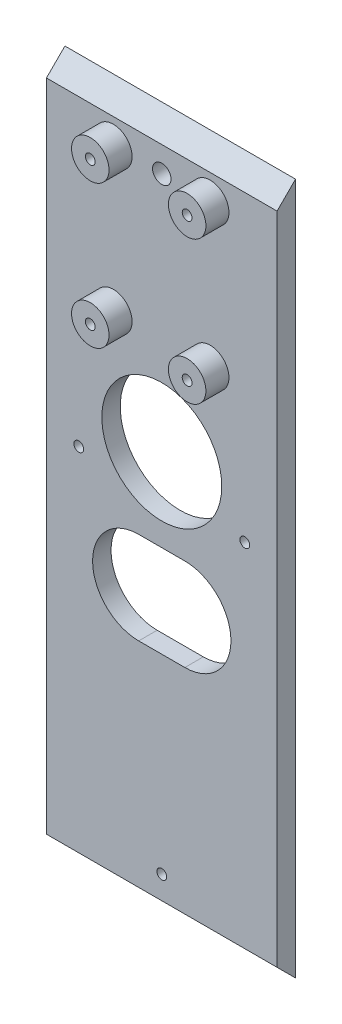
ISO-10303-21;
HEADER;
FILE_DESCRIPTION(('STEP AP214'),'2;1');
FILE_NAME('part.step','',(''),(''),'','','');
FILE_SCHEMA(('AUTOMOTIVE_DESIGN { 1 0 10303 214 1 1 1 1 }'));
ENDSEC;
DATA;
#1=APPLICATION_CONTEXT('core data for automotive mechanical design processes');
#2=APPLICATION_PROTOCOL_DEFINITION('international standard','automotive_design',2000,#1);
#3=PRODUCT_CONTEXT('',#1,'mechanical');
#4=PRODUCT('Part','Part','',(#3));
#5=PRODUCT_RELATED_PRODUCT_CATEGORY('part','',(#4));
#6=PRODUCT_DEFINITION_FORMATION('','',#4);
#7=PRODUCT_DEFINITION_CONTEXT('part definition',#1,'design');
#8=PRODUCT_DEFINITION('design','',#6,#7);
#9=PRODUCT_DEFINITION_SHAPE('','',#8);
#10=(LENGTH_UNIT() NAMED_UNIT(*) SI_UNIT(.MILLI.,.METRE.));
#11=(NAMED_UNIT(*) PLANE_ANGLE_UNIT() SI_UNIT($,.RADIAN.));
#12=(NAMED_UNIT(*) SI_UNIT($,.STERADIAN.) SOLID_ANGLE_UNIT());
#13=UNCERTAINTY_MEASURE_WITH_UNIT(LENGTH_MEASURE(1.E-05),#10,'distance_accuracy_value','');
#14=(GEOMETRIC_REPRESENTATION_CONTEXT(3) GLOBAL_UNCERTAINTY_ASSIGNED_CONTEXT((#13)) GLOBAL_UNIT_ASSIGNED_CONTEXT((#10,
#11,#12)) REPRESENTATION_CONTEXT('',''));
#15=CARTESIAN_POINT('',(0.,0.,0.));
#16=DIRECTION('',(0.,0.,1.));
#17=DIRECTION('',(1.,0.,0.));
#18=AXIS2_PLACEMENT_3D('',#15,#16,#17);
#19=CARTESIAN_POINT('',(0.,0.,4.));
#20=DIRECTION('',(-1.,0.,0.));
#21=DIRECTION('',(0.,0.,1.));
#22=AXIS2_PLACEMENT_3D('',#19,#20,#21);
#23=PLANE('',#22);
#24=DIRECTION('',(0.,1.,0.));
#25=VECTOR('',#24,1.);
#26=CARTESIAN_POINT('',(0.,0.,0.));
#27=LINE('',#26,#25);
#28=CARTESIAN_POINT('',(0.,0.,0.));
#29=VERTEX_POINT('',#28);
#30=CARTESIAN_POINT('',(0.,150.,0.));
#31=VERTEX_POINT('',#30);
#32=EDGE_CURVE('E182',#29,#31,#27,.T.);
#33=ORIENTED_EDGE('',*,*,#32,.T.);
#34=DIRECTION('',(0.,0.707106781186545,-0.70710678118655));
#35=VECTOR('',#34,1.);
#36=CARTESIAN_POINT('',(0.,146.,4.));
#37=LINE('',#36,#35);
#38=CARTESIAN_POINT('',(0.,146.,4.));
#39=VERTEX_POINT('',#38);
#40=EDGE_CURVE('E199',#31,#39,#37,.F.);
#41=ORIENTED_EDGE('',*,*,#40,.T.);
#42=DIRECTION('',(0.,1.,0.));
#43=VECTOR('',#42,1.);
#44=CARTESIAN_POINT('',(0.,0.,4.));
#45=LINE('',#44,#43);
#46=CARTESIAN_POINT('',(0.,4.,4.));
#47=VERTEX_POINT('',#46);
#48=EDGE_CURVE('E172',#47,#39,#45,.T.);
#49=ORIENTED_EDGE('',*,*,#48,.F.);
#50=DIRECTION('',(0.,0.707106781186548,0.707106781186548));
#51=VECTOR('',#50,1.);
#52=CARTESIAN_POINT('',(0.,4.,4.));
#53=LINE('',#52,#51);
#54=EDGE_CURVE('E197',#47,#29,#53,.F.);
#55=ORIENTED_EDGE('',*,*,#54,.T.);
#56=EDGE_LOOP('',(#33,#41,#49,#55));
#57=FACE_BOUND('',#56,.T.);
#58=ADVANCED_FACE('F43',(#57),#23,.F.);
#59=CARTESIAN_POINT('',(-50.,0.,4.));
#60=DIRECTION('',(1.,0.,0.));
#61=DIRECTION('',(0.,0.,-1.));
#62=AXIS2_PLACEMENT_3D('',#59,#60,#61);
#63=PLANE('',#62);
#64=DIRECTION('',(0.,-1.,0.));
#65=VECTOR('',#64,1.);
#66=CARTESIAN_POINT('',(-50.,0.,4.));
#67=LINE('',#66,#65);
#68=CARTESIAN_POINT('',(-50.,146.,4.));
#69=VERTEX_POINT('',#68);
#70=CARTESIAN_POINT('',(-50.,4.,4.));
#71=VERTEX_POINT('',#70);
#72=EDGE_CURVE('E175',#69,#71,#67,.T.);
#73=ORIENTED_EDGE('',*,*,#72,.F.);
#74=DIRECTION('',(0.,-0.707106781186545,0.70710678118655));
#75=VECTOR('',#74,1.);
#76=CARTESIAN_POINT('',(-50.,146.,4.));
#77=LINE('',#76,#75);
#78=CARTESIAN_POINT('',(-50.,150.,0.));
#79=VERTEX_POINT('',#78);
#80=EDGE_CURVE('E195',#69,#79,#77,.F.);
#81=ORIENTED_EDGE('',*,*,#80,.T.);
#82=DIRECTION('',(0.,-1.,0.));
#83=VECTOR('',#82,1.);
#84=CARTESIAN_POINT('',(-50.,0.,0.));
#85=LINE('',#84,#83);
#86=CARTESIAN_POINT('',(-50.,0.,0.));
#87=VERTEX_POINT('',#86);
#88=EDGE_CURVE('E176',#79,#87,#85,.T.);
#89=ORIENTED_EDGE('',*,*,#88,.T.);
#90=DIRECTION('',(0.,-0.707106781186548,-0.707106781186548));
#91=VECTOR('',#90,1.);
#92=CARTESIAN_POINT('',(-50.,4.,4.));
#93=LINE('',#92,#91);
#94=EDGE_CURVE('E193',#87,#71,#93,.F.);
#95=ORIENTED_EDGE('',*,*,#94,.T.);
#96=EDGE_LOOP('',(#73,#81,#89,#95));
#97=FACE_BOUND('',#96,.T.);
#98=ADVANCED_FACE('F214',(#97),#63,.F.);
#99=CARTESIAN_POINT('',(0.,0.,4.));
#100=DIRECTION('',(0.,0.,-1.));
#101=DIRECTION('',(-1.,0.,0.));
#102=AXIS2_PLACEMENT_3D('',#99,#100,#101);
#103=PLANE('',#102);
#104=CARTESIAN_POINT('',(-35.5,109.5,4.));
#105=DIRECTION('',(0.,0.,-1.));
#106=DIRECTION('',(-1.,0.,0.));
#107=AXIS2_PLACEMENT_3D('',#104,#105,#106);
#108=CIRCLE('',#107,4.065);
#109=CARTESIAN_POINT('',(-39.565,109.5,4.));
#110=VERTEX_POINT('',#109);
#111=EDGE_CURVE('E11',#110,#110,#108,.F.);
#112=ORIENTED_EDGE('',*,*,#111,.F.);
#113=EDGE_LOOP('',(#112));
#114=FACE_BOUND('',#113,.T.);
#115=CARTESIAN_POINT('',(-14.5,109.5,4.));
#116=DIRECTION('',(0.,0.,-1.));
#117=DIRECTION('',(-1.,0.,0.));
#118=AXIS2_PLACEMENT_3D('',#115,#116,#117);
#119=CIRCLE('',#118,4.065);
#120=CARTESIAN_POINT('',(-18.565,109.5,4.));
#121=VERTEX_POINT('',#120);
#122=EDGE_CURVE('E52',#121,#121,#119,.F.);
#123=ORIENTED_EDGE('',*,*,#122,.F.);
#124=EDGE_LOOP('',(#123));
#125=FACE_BOUND('',#124,.T.);
#126=CARTESIAN_POINT('',(-14.5,140.5,4.));
#127=DIRECTION('',(0.,0.,-1.));
#128=DIRECTION('',(-1.,0.,0.));
#129=AXIS2_PLACEMENT_3D('',#126,#127,#128);
#130=CIRCLE('',#129,4.065);
#131=CARTESIAN_POINT('',(-18.565,140.5,4.));
#132=VERTEX_POINT('',#131);
#133=EDGE_CURVE('E204',#132,#132,#130,.F.);
#134=ORIENTED_EDGE('',*,*,#133,.F.);
#135=EDGE_LOOP('',(#134));
#136=FACE_BOUND('',#135,.T.);
#137=CARTESIAN_POINT('',(-35.5,140.5,4.));
#138=DIRECTION('',(0.,0.,-1.));
#139=DIRECTION('',(-1.,0.,0.));
#140=AXIS2_PLACEMENT_3D('',#137,#138,#139);
#141=CIRCLE('',#140,4.065);
#142=CARTESIAN_POINT('',(-39.565,140.5,4.));
#143=VERTEX_POINT('',#142);
#144=EDGE_CURVE('E201',#143,#143,#141,.F.);
#145=ORIENTED_EDGE('',*,*,#144,.F.);
#146=EDGE_LOOP('',(#145));
#147=FACE_BOUND('',#146,.T.);
#148=CARTESIAN_POINT('',(-25.,140.5,4.));
#149=DIRECTION('',(0.,0.,1.));
#150=DIRECTION('',(1.,0.,0.));
#151=AXIS2_PLACEMENT_3D('',#148,#149,#150);
#152=CIRCLE('',#151,2.00000000000001);
#153=CARTESIAN_POINT('',(-23.,140.5,4.));
#154=VERTEX_POINT('',#153);
#155=EDGE_CURVE('E158',#154,#154,#152,.T.);
#156=ORIENTED_EDGE('',*,*,#155,.F.);
#157=EDGE_LOOP('',(#156));
#158=FACE_BOUND('',#157,.T.);
#159=CARTESIAN_POINT('',(-43.,80.3,4.));
#160=DIRECTION('',(0.,0.,1.));
#161=DIRECTION('',(1.,0.,0.));
#162=AXIS2_PLACEMENT_3D('',#159,#160,#161);
#163=CIRCLE('',#162,1.065);
#164=CARTESIAN_POINT('',(-41.935,80.3,4.));
#165=VERTEX_POINT('',#164);
#166=EDGE_CURVE('E152',#165,#165,#163,.T.);
#167=ORIENTED_EDGE('',*,*,#166,.F.);
#168=EDGE_LOOP('',(#167));
#169=FACE_BOUND('',#168,.T.);
#170=CARTESIAN_POINT('',(-7.00000000000001,80.3,4.));
#171=DIRECTION('',(0.,0.,1.));
#172=DIRECTION('',(1.,0.,0.));
#173=AXIS2_PLACEMENT_3D('',#170,#171,#172);
#174=CIRCLE('',#173,1.065);
#175=CARTESIAN_POINT('',(-5.935,80.3,4.));
#176=VERTEX_POINT('',#175);
#177=EDGE_CURVE('E116',#176,#176,#174,.T.);
#178=ORIENTED_EDGE('',*,*,#177,.F.);
#179=EDGE_LOOP('',(#178));
#180=FACE_BOUND('',#179,.T.);
#181=DIRECTION('',(1.,0.,0.));
#182=VECTOR('',#181,1.);
#183=CARTESIAN_POINT('',(-30.,50.3,4.));
#184=LINE('',#183,#182);
#185=CARTESIAN_POINT('',(-30.,50.3,4.));
#186=VERTEX_POINT('',#185);
#187=CARTESIAN_POINT('',(-20.,50.3,4.));
#188=VERTEX_POINT('',#187);
#189=EDGE_CURVE('E130',#186,#188,#184,.T.);
#190=ORIENTED_EDGE('',*,*,#189,.F.);
#191=CARTESIAN_POINT('',(-30.,60.3,4.));
#192=DIRECTION('',(0.,0.,1.));
#193=DIRECTION('',(1.,0.,0.));
#194=AXIS2_PLACEMENT_3D('',#191,#192,#193);
#195=CIRCLE('',#194,9.99999999999999);
#196=CARTESIAN_POINT('',(-30.,70.3,4.));
#197=VERTEX_POINT('',#196);
#198=EDGE_CURVE('E59',#197,#186,#195,.T.);
#199=ORIENTED_EDGE('',*,*,#198,.F.);
#200=DIRECTION('',(-1.,0.,0.));
#201=VECTOR('',#200,1.);
#202=CARTESIAN_POINT('',(-30.,70.3,4.));
#203=LINE('',#202,#201);
#204=CARTESIAN_POINT('',(-20.,70.3,4.));
#205=VERTEX_POINT('',#204);
#206=EDGE_CURVE('E119',#205,#197,#203,.T.);
#207=ORIENTED_EDGE('',*,*,#206,.F.);
#208=CARTESIAN_POINT('',(-20.,60.3,4.));
#209=DIRECTION('',(0.,0.,1.));
#210=DIRECTION('',(1.,0.,0.));
#211=AXIS2_PLACEMENT_3D('',#208,#209,#210);
#212=CIRCLE('',#211,9.99999999999999);
#213=EDGE_CURVE('E124',#188,#205,#212,.T.);
#214=ORIENTED_EDGE('',*,*,#213,.F.);
#215=EDGE_LOOP('',(#190,#199,#207,#214));
#216=FACE_BOUND('',#215,.T.);
#217=CARTESIAN_POINT('',(-25.,9.00000000000001,4.));
#218=DIRECTION('',(0.,0.,1.));
#219=DIRECTION('',(1.,0.,0.));
#220=AXIS2_PLACEMENT_3D('',#217,#218,#219);
#221=CIRCLE('',#220,1.065);
#222=CARTESIAN_POINT('',(-23.935,9.00000000000001,4.));
#223=VERTEX_POINT('',#222);
#224=EDGE_CURVE('E134',#223,#223,#221,.T.);
#225=ORIENTED_EDGE('',*,*,#224,.F.);
#226=EDGE_LOOP('',(#225));
#227=FACE_BOUND('',#226,.T.);
#228=CARTESIAN_POINT('',(-25.,88.3,4.));
#229=DIRECTION('',(0.,0.,1.));
#230=DIRECTION('',(1.,0.,0.));
#231=AXIS2_PLACEMENT_3D('',#228,#229,#230);
#232=CIRCLE('',#231,13.);
#233=CARTESIAN_POINT('',(-12.,88.3,4.));
#234=VERTEX_POINT('',#233);
#235=EDGE_CURVE('E169',#234,#234,#232,.T.);
#236=ORIENTED_EDGE('',*,*,#235,.F.);
#237=EDGE_LOOP('',(#236));
#238=FACE_BOUND('',#237,.T.);
#239=ORIENTED_EDGE('',*,*,#48,.T.);
#240=DIRECTION('',(-1.,0.,0.));
#241=VECTOR('',#240,1.);
#242=CARTESIAN_POINT('',(0.,146.,4.));
#243=LINE('',#242,#241);
#244=EDGE_CURVE('E190',#39,#69,#243,.T.);
#245=ORIENTED_EDGE('',*,*,#244,.T.);
#246=ORIENTED_EDGE('',*,*,#72,.T.);
#247=DIRECTION('',(1.,0.,0.));
#248=VECTOR('',#247,1.);
#249=CARTESIAN_POINT('',(0.,4.,4.));
#250=LINE('',#249,#248);
#251=EDGE_CURVE('E179',#71,#47,#250,.T.);
#252=ORIENTED_EDGE('',*,*,#251,.T.);
#253=EDGE_LOOP('',(#239,#245,#246,#252));
#254=FACE_BOUND('',#253,.T.);
#255=ADVANCED_FACE('F127',(#114,#125,#136,#147,#158,#169,#180,#216,#227,#238,#254),#103,.F.);
#256=CARTESIAN_POINT('',(0.,0.,0.));
#257=DIRECTION('',(0.,0.,-1.));
#258=DIRECTION('',(-1.,0.,0.));
#259=AXIS2_PLACEMENT_3D('',#256,#257,#258);
#260=PLANE('',#259);
#261=CARTESIAN_POINT('',(-25.,140.5,0.));
#262=DIRECTION('',(0.,0.,1.));
#263=DIRECTION('',(1.,0.,0.));
#264=AXIS2_PLACEMENT_3D('',#261,#262,#263);
#265=CIRCLE('',#264,2.00000000000001);
#266=CARTESIAN_POINT('',(-23.,140.5,0.));
#267=VERTEX_POINT('',#266);
#268=EDGE_CURVE('E161',#267,#267,#265,.T.);
#269=ORIENTED_EDGE('',*,*,#268,.T.);
#270=EDGE_LOOP('',(#269));
#271=FACE_BOUND('',#270,.T.);
#272=CARTESIAN_POINT('',(-43.,80.3,0.));
#273=DIRECTION('',(0.,0.,1.));
#274=DIRECTION('',(1.,0.,0.));
#275=AXIS2_PLACEMENT_3D('',#272,#273,#274);
#276=CIRCLE('',#275,1.065);
#277=CARTESIAN_POINT('',(-41.935,80.3,0.));
#278=VERTEX_POINT('',#277);
#279=EDGE_CURVE('E155',#278,#278,#276,.T.);
#280=ORIENTED_EDGE('',*,*,#279,.T.);
#281=EDGE_LOOP('',(#280));
#282=FACE_BOUND('',#281,.T.);
#283=CARTESIAN_POINT('',(-7.00000000000001,80.3,0.));
#284=DIRECTION('',(0.,0.,1.));
#285=DIRECTION('',(1.,0.,0.));
#286=AXIS2_PLACEMENT_3D('',#283,#284,#285);
#287=CIRCLE('',#286,1.065);
#288=CARTESIAN_POINT('',(-5.935,80.3,0.));
#289=VERTEX_POINT('',#288);
#290=EDGE_CURVE('E149',#289,#289,#287,.T.);
#291=ORIENTED_EDGE('',*,*,#290,.T.);
#292=EDGE_LOOP('',(#291));
#293=FACE_BOUND('',#292,.T.);
#294=CARTESIAN_POINT('',(-30.,60.3,0.));
#295=DIRECTION('',(0.,0.,1.));
#296=DIRECTION('',(1.,0.,0.));
#297=AXIS2_PLACEMENT_3D('',#294,#295,#296);
#298=CIRCLE('',#297,9.99999999999999);
#299=CARTESIAN_POINT('',(-30.,70.3,0.));
#300=VERTEX_POINT('',#299);
#301=CARTESIAN_POINT('',(-30.,50.3,0.));
#302=VERTEX_POINT('',#301);
#303=EDGE_CURVE('E111',#300,#302,#298,.T.);
#304=ORIENTED_EDGE('',*,*,#303,.T.);
#305=DIRECTION('',(1.,0.,0.));
#306=VECTOR('',#305,1.);
#307=CARTESIAN_POINT('',(-30.,50.3,0.));
#308=LINE('',#307,#306);
#309=CARTESIAN_POINT('',(-20.,50.3,0.));
#310=VERTEX_POINT('',#309);
#311=EDGE_CURVE('E143',#302,#310,#308,.T.);
#312=ORIENTED_EDGE('',*,*,#311,.T.);
#313=CARTESIAN_POINT('',(-20.,60.3,0.));
#314=DIRECTION('',(0.,0.,1.));
#315=DIRECTION('',(1.,0.,0.));
#316=AXIS2_PLACEMENT_3D('',#313,#314,#315);
#317=CIRCLE('',#316,9.99999999999999);
#318=CARTESIAN_POINT('',(-20.,70.3,0.));
#319=VERTEX_POINT('',#318);
#320=EDGE_CURVE('E67',#310,#319,#317,.T.);
#321=ORIENTED_EDGE('',*,*,#320,.T.);
#322=DIRECTION('',(-1.,0.,0.));
#323=VECTOR('',#322,1.);
#324=CARTESIAN_POINT('',(-30.,70.3,0.));
#325=LINE('',#324,#323);
#326=EDGE_CURVE('E139',#319,#300,#325,.T.);
#327=ORIENTED_EDGE('',*,*,#326,.T.);
#328=EDGE_LOOP('',(#304,#312,#321,#327));
#329=FACE_BOUND('',#328,.T.);
#330=CARTESIAN_POINT('',(-25.,9.00000000000001,0.));
#331=DIRECTION('',(0.,0.,1.));
#332=DIRECTION('',(1.,0.,0.));
#333=AXIS2_PLACEMENT_3D('',#330,#331,#332);
#334=CIRCLE('',#333,1.065);
#335=CARTESIAN_POINT('',(-23.935,9.00000000000001,0.));
#336=VERTEX_POINT('',#335);
#337=EDGE_CURVE('E131',#336,#336,#334,.T.);
#338=ORIENTED_EDGE('',*,*,#337,.T.);
#339=EDGE_LOOP('',(#338));
#340=FACE_BOUND('',#339,.T.);
#341=CARTESIAN_POINT('',(-25.,88.3,0.));
#342=DIRECTION('',(0.,0.,1.));
#343=DIRECTION('',(1.,0.,0.));
#344=AXIS2_PLACEMENT_3D('',#341,#342,#343);
#345=CIRCLE('',#344,13.);
#346=CARTESIAN_POINT('',(-12.,88.3,0.));
#347=VERTEX_POINT('',#346);
#348=EDGE_CURVE('E165',#347,#347,#345,.T.);
#349=ORIENTED_EDGE('',*,*,#348,.T.);
#350=EDGE_LOOP('',(#349));
#351=FACE_BOUND('',#350,.T.);
#352=DIRECTION('',(1.,0.,0.));
#353=VECTOR('',#352,1.);
#354=CARTESIAN_POINT('',(0.,0.,0.));
#355=LINE('',#354,#353);
#356=EDGE_CURVE('E168',#87,#29,#355,.T.);
#357=ORIENTED_EDGE('',*,*,#356,.F.);
#358=ORIENTED_EDGE('',*,*,#88,.F.);
#359=DIRECTION('',(-1.,0.,0.));
#360=VECTOR('',#359,1.);
#361=CARTESIAN_POINT('',(0.,150.,0.));
#362=LINE('',#361,#360);
#363=EDGE_CURVE('E184',#31,#79,#362,.T.);
#364=ORIENTED_EDGE('',*,*,#363,.F.);
#365=ORIENTED_EDGE('',*,*,#32,.F.);
#366=EDGE_LOOP('',(#357,#358,#364,#365));
#367=FACE_BOUND('',#366,.T.);
#368=ADVANCED_FACE('F213',(#271,#282,#293,#329,#340,#351,#367),#260,.T.);
#369=CARTESIAN_POINT('',(0.,146.,4.));
#370=DIRECTION('',(0.,-0.70710678118655,-0.707106781186545));
#371=DIRECTION('',(-1.,0.,0.));
#372=AXIS2_PLACEMENT_3D('',#369,#370,#371);
#373=PLANE('',#372);
#374=ORIENTED_EDGE('',*,*,#40,.F.);
#375=ORIENTED_EDGE('',*,*,#363,.T.);
#376=ORIENTED_EDGE('',*,*,#80,.F.);
#377=ORIENTED_EDGE('',*,*,#244,.F.);
#378=EDGE_LOOP('',(#374,#375,#376,#377));
#379=FACE_BOUND('',#378,.T.);
#380=ADVANCED_FACE('F257',(#379),#373,.F.);
#381=CARTESIAN_POINT('',(0.,4.,4.));
#382=DIRECTION('',(0.,0.707106781186547,-0.707106781186547));
#383=DIRECTION('',(1.,0.,0.));
#384=AXIS2_PLACEMENT_3D('',#381,#382,#383);
#385=PLANE('',#384);
#386=ORIENTED_EDGE('',*,*,#94,.F.);
#387=ORIENTED_EDGE('',*,*,#356,.T.);
#388=ORIENTED_EDGE('',*,*,#54,.F.);
#389=ORIENTED_EDGE('',*,*,#251,.F.);
#390=EDGE_LOOP('',(#386,#387,#388,#389));
#391=FACE_BOUND('',#390,.T.);
#392=ADVANCED_FACE('F46',(#391),#385,.F.);
#393=CARTESIAN_POINT('',(-25.,88.3,0.));
#394=DIRECTION('',(0.,0.,1.));
#395=DIRECTION('',(1.,0.,0.));
#396=AXIS2_PLACEMENT_3D('',#393,#394,#395);
#397=CYLINDRICAL_SURFACE('',#396,13.);
#398=ORIENTED_EDGE('',*,*,#348,.F.);
#399=EDGE_LOOP('',(#398));
#400=FACE_BOUND('',#399,.T.);
#401=ORIENTED_EDGE('',*,*,#235,.T.);
#402=EDGE_LOOP('',(#401));
#403=FACE_BOUND('',#402,.T.);
#404=ADVANCED_FACE('F265',(#400,#403),#397,.F.);
#405=CARTESIAN_POINT('',(-25.,9.00000000000001,0.));
#406=DIRECTION('',(0.,0.,1.));
#407=DIRECTION('',(1.,0.,0.));
#408=AXIS2_PLACEMENT_3D('',#405,#406,#407);
#409=CYLINDRICAL_SURFACE('',#408,1.065);
#410=ORIENTED_EDGE('',*,*,#337,.F.);
#411=EDGE_LOOP('',(#410));
#412=FACE_BOUND('',#411,.T.);
#413=ORIENTED_EDGE('',*,*,#224,.T.);
#414=EDGE_LOOP('',(#413));
#415=FACE_BOUND('',#414,.T.);
#416=ADVANCED_FACE('F287',(#412,#415),#409,.F.);
#417=CARTESIAN_POINT('',(-30.,60.3,0.));
#418=DIRECTION('',(0.,0.,1.));
#419=DIRECTION('',(1.,0.,0.));
#420=AXIS2_PLACEMENT_3D('',#417,#418,#419);
#421=CYLINDRICAL_SURFACE('',#420,9.99999999999999);
#422=ORIENTED_EDGE('',*,*,#198,.T.);
#423=DIRECTION('',(0.,0.,1.));
#424=VECTOR('',#423,1.);
#425=CARTESIAN_POINT('',(-30.,50.3,0.));
#426=LINE('',#425,#424);
#427=EDGE_CURVE('E141',#302,#186,#426,.T.);
#428=ORIENTED_EDGE('',*,*,#427,.F.);
#429=ORIENTED_EDGE('',*,*,#303,.F.);
#430=DIRECTION('',(0.,0.,1.));
#431=VECTOR('',#430,1.);
#432=CARTESIAN_POINT('',(-30.,70.3,0.));
#433=LINE('',#432,#431);
#434=EDGE_CURVE('E107',#300,#197,#433,.T.);
#435=ORIENTED_EDGE('',*,*,#434,.T.);
#436=EDGE_LOOP('',(#422,#428,#429,#435));
#437=FACE_BOUND('',#436,.T.);
#438=ADVANCED_FACE('F109',(#437),#421,.F.);
#439=CARTESIAN_POINT('',(-30.,70.3,0.));
#440=DIRECTION('',(0.,1.,0.));
#441=DIRECTION('',(0.,0.,1.));
#442=AXIS2_PLACEMENT_3D('',#439,#440,#441);
#443=PLANE('',#442);
#444=ORIENTED_EDGE('',*,*,#206,.T.);
#445=ORIENTED_EDGE('',*,*,#434,.F.);
#446=ORIENTED_EDGE('',*,*,#326,.F.);
#447=DIRECTION('',(0.,0.,1.));
#448=VECTOR('',#447,1.);
#449=CARTESIAN_POINT('',(-20.,70.3,0.));
#450=LINE('',#449,#448);
#451=EDGE_CURVE('E115',#319,#205,#450,.T.);
#452=ORIENTED_EDGE('',*,*,#451,.T.);
#453=EDGE_LOOP('',(#444,#445,#446,#452));
#454=FACE_BOUND('',#453,.T.);
#455=ADVANCED_FACE('F120',(#454),#443,.F.);
#456=CARTESIAN_POINT('',(-20.,60.3,0.));
#457=DIRECTION('',(0.,0.,1.));
#458=DIRECTION('',(1.,0.,0.));
#459=AXIS2_PLACEMENT_3D('',#456,#457,#458);
#460=CYLINDRICAL_SURFACE('',#459,9.99999999999999);
#461=ORIENTED_EDGE('',*,*,#213,.T.);
#462=ORIENTED_EDGE('',*,*,#451,.F.);
#463=ORIENTED_EDGE('',*,*,#320,.F.);
#464=DIRECTION('',(0.,0.,1.));
#465=VECTOR('',#464,1.);
#466=CARTESIAN_POINT('',(-20.,50.3,0.));
#467=LINE('',#466,#465);
#468=EDGE_CURVE('E518',#310,#188,#467,.T.);
#469=ORIENTED_EDGE('',*,*,#468,.T.);
#470=EDGE_LOOP('',(#461,#462,#463,#469));
#471=FACE_BOUND('',#470,.T.);
#472=ADVANCED_FACE('F242',(#471),#460,.F.);
#473=CARTESIAN_POINT('',(-30.,50.3,0.));
#474=DIRECTION('',(0.,-1.,0.));
#475=DIRECTION('',(1.,0.,0.));
#476=AXIS2_PLACEMENT_3D('',#473,#474,#475);
#477=PLANE('',#476);
#478=ORIENTED_EDGE('',*,*,#189,.T.);
#479=ORIENTED_EDGE('',*,*,#468,.F.);
#480=ORIENTED_EDGE('',*,*,#311,.F.);
#481=ORIENTED_EDGE('',*,*,#427,.T.);
#482=EDGE_LOOP('',(#478,#479,#480,#481));
#483=FACE_BOUND('',#482,.T.);
#484=ADVANCED_FACE('F232',(#483),#477,.F.);
#485=CARTESIAN_POINT('',(-7.00000000000001,80.3,0.));
#486=DIRECTION('',(0.,0.,1.));
#487=DIRECTION('',(1.,0.,0.));
#488=AXIS2_PLACEMENT_3D('',#485,#486,#487);
#489=CYLINDRICAL_SURFACE('',#488,1.065);
#490=ORIENTED_EDGE('',*,*,#290,.F.);
#491=EDGE_LOOP('',(#490));
#492=FACE_BOUND('',#491,.T.);
#493=ORIENTED_EDGE('',*,*,#177,.T.);
#494=EDGE_LOOP('',(#493));
#495=FACE_BOUND('',#494,.T.);
#496=ADVANCED_FACE('F229',(#492,#495),#489,.F.);
#497=CARTESIAN_POINT('',(-43.,80.3,0.));
#498=DIRECTION('',(0.,0.,1.));
#499=DIRECTION('',(1.,0.,0.));
#500=AXIS2_PLACEMENT_3D('',#497,#498,#499);
#501=CYLINDRICAL_SURFACE('',#500,1.065);
#502=ORIENTED_EDGE('',*,*,#279,.F.);
#503=EDGE_LOOP('',(#502));
#504=FACE_BOUND('',#503,.T.);
#505=ORIENTED_EDGE('',*,*,#166,.T.);
#506=EDGE_LOOP('',(#505));
#507=FACE_BOUND('',#506,.T.);
#508=ADVANCED_FACE('F231',(#504,#507),#501,.F.);
#509=CARTESIAN_POINT('',(-25.,140.5,0.));
#510=DIRECTION('',(0.,0.,1.));
#511=DIRECTION('',(1.,0.,0.));
#512=AXIS2_PLACEMENT_3D('',#509,#510,#511);
#513=CYLINDRICAL_SURFACE('',#512,2.00000000000001);
#514=ORIENTED_EDGE('',*,*,#268,.F.);
#515=EDGE_LOOP('',(#514));
#516=FACE_BOUND('',#515,.T.);
#517=ORIENTED_EDGE('',*,*,#155,.T.);
#518=EDGE_LOOP('',(#517));
#519=FACE_BOUND('',#518,.T.);
#520=ADVANCED_FACE('F239',(#516,#519),#513,.F.);
#521=CARTESIAN_POINT('',(-35.5,140.5,9.));
#522=DIRECTION('',(0.,0.,1.));
#523=DIRECTION('',(1.,0.,0.));
#524=AXIS2_PLACEMENT_3D('',#521,#522,#523);
#525=PLANE('',#524);
#526=CARTESIAN_POINT('',(-35.5,140.5,9.));
#527=DIRECTION('',(0.,0.,1.));
#528=DIRECTION('',(1.,0.,0.));
#529=AXIS2_PLACEMENT_3D('',#526,#527,#528);
#530=CIRCLE('',#529,4.065);
#531=CARTESIAN_POINT('',(-31.435,140.5,9.));
#532=VERTEX_POINT('',#531);
#533=EDGE_CURVE('E164',#532,#532,#530,.T.);
#534=ORIENTED_EDGE('',*,*,#533,.T.);
#535=EDGE_LOOP('',(#534));
#536=FACE_BOUND('',#535,.T.);
#537=CARTESIAN_POINT('',(-35.5,140.5,9.));
#538=DIRECTION('',(0.,0.,1.));
#539=DIRECTION('',(1.,0.,0.));
#540=AXIS2_PLACEMENT_3D('',#537,#538,#539);
#541=CIRCLE('',#540,1.06499999999999);
#542=CARTESIAN_POINT('',(-34.435,140.5,9.));
#543=VERTEX_POINT('',#542);
#544=EDGE_CURVE('E507',#543,#543,#541,.T.);
#545=ORIENTED_EDGE('',*,*,#544,.F.);
#546=EDGE_LOOP('',(#545));
#547=FACE_BOUND('',#546,.T.);
#548=ADVANCED_FACE('F290',(#536,#547),#525,.T.);
#549=CARTESIAN_POINT('',(-35.5,140.5,9.));
#550=DIRECTION('',(0.,0.,-1.));
#551=DIRECTION('',(-1.,0.,0.));
#552=AXIS2_PLACEMENT_3D('',#549,#550,#551);
#553=CYLINDRICAL_SURFACE('',#552,4.065);
#554=ORIENTED_EDGE('',*,*,#533,.F.);
#555=EDGE_LOOP('',(#554));
#556=FACE_BOUND('',#555,.T.);
#557=ORIENTED_EDGE('',*,*,#144,.T.);
#558=EDGE_LOOP('',(#557));
#559=FACE_BOUND('',#558,.T.);
#560=ADVANCED_FACE('F295',(#556,#559),#553,.T.);
#561=CARTESIAN_POINT('',(-35.5,140.5,9.));
#562=DIRECTION('',(0.,0.,-1.));
#563=DIRECTION('',(-1.,0.,0.));
#564=AXIS2_PLACEMENT_3D('',#561,#562,#563);
#565=CYLINDRICAL_SURFACE('',#564,1.06499999999999);
#566=ORIENTED_EDGE('',*,*,#544,.T.);
#567=EDGE_LOOP('',(#566));
#568=FACE_BOUND('',#567,.T.);
#569=CARTESIAN_POINT('',(-35.5,140.5,4.));
#570=DIRECTION('',(0.,0.,1.));
#571=DIRECTION('',(1.,0.,0.));
#572=AXIS2_PLACEMENT_3D('',#569,#570,#571);
#573=CIRCLE('',#572,1.06499999999999);
#574=CARTESIAN_POINT('',(-34.435,140.5,4.));
#575=VERTEX_POINT('',#574);
#576=EDGE_CURVE('E510',#575,#575,#573,.T.);
#577=ORIENTED_EDGE('',*,*,#576,.F.);
#578=EDGE_LOOP('',(#577));
#579=FACE_BOUND('',#578,.T.);
#580=ADVANCED_FACE('F303',(#568,#579),#565,.F.);
#581=CARTESIAN_POINT('',(-14.5,140.5,9.));
#582=DIRECTION('',(0.,0.,1.));
#583=DIRECTION('',(1.,0.,0.));
#584=AXIS2_PLACEMENT_3D('',#581,#582,#583);
#585=PLANE('',#584);
#586=CARTESIAN_POINT('',(-14.5,140.5,9.));
#587=DIRECTION('',(0.,0.,1.));
#588=DIRECTION('',(1.,0.,0.));
#589=AXIS2_PLACEMENT_3D('',#586,#587,#588);
#590=CIRCLE('',#589,4.065);
#591=CARTESIAN_POINT('',(-10.435,140.5,9.));
#592=VERTEX_POINT('',#591);
#593=EDGE_CURVE('E539',#592,#592,#590,.T.);
#594=ORIENTED_EDGE('',*,*,#593,.T.);
#595=EDGE_LOOP('',(#594));
#596=FACE_BOUND('',#595,.T.);
#597=CARTESIAN_POINT('',(-14.5,140.5,9.));
#598=DIRECTION('',(0.,0.,1.));
#599=DIRECTION('',(1.,0.,0.));
#600=AXIS2_PLACEMENT_3D('',#597,#598,#599);
#601=CIRCLE('',#600,1.065);
#602=CARTESIAN_POINT('',(-13.435,140.5,9.));
#603=VERTEX_POINT('',#602);
#604=EDGE_CURVE('E535',#603,#603,#601,.T.);
#605=ORIENTED_EDGE('',*,*,#604,.F.);
#606=EDGE_LOOP('',(#605));
#607=FACE_BOUND('',#606,.T.);
#608=ADVANCED_FACE('F397',(#596,#607),#585,.T.);
#609=CARTESIAN_POINT('',(-14.5,140.5,9.));
#610=DIRECTION('',(0.,0.,-1.));
#611=DIRECTION('',(-1.,0.,0.));
#612=AXIS2_PLACEMENT_3D('',#609,#610,#611);
#613=CYLINDRICAL_SURFACE('',#612,4.065);
#614=ORIENTED_EDGE('',*,*,#593,.F.);
#615=EDGE_LOOP('',(#614));
#616=FACE_BOUND('',#615,.T.);
#617=ORIENTED_EDGE('',*,*,#133,.T.);
#618=EDGE_LOOP('',(#617));
#619=FACE_BOUND('',#618,.T.);
#620=ADVANCED_FACE('F406',(#616,#619),#613,.T.);
#621=CARTESIAN_POINT('',(-14.5,140.5,9.));
#622=DIRECTION('',(0.,0.,-1.));
#623=DIRECTION('',(-1.,0.,0.));
#624=AXIS2_PLACEMENT_3D('',#621,#622,#623);
#625=CYLINDRICAL_SURFACE('',#624,1.065);
#626=ORIENTED_EDGE('',*,*,#604,.T.);
#627=EDGE_LOOP('',(#626));
#628=FACE_BOUND('',#627,.T.);
#629=CARTESIAN_POINT('',(-14.5,140.5,4.));
#630=DIRECTION('',(0.,0.,1.));
#631=DIRECTION('',(1.,0.,0.));
#632=AXIS2_PLACEMENT_3D('',#629,#630,#631);
#633=CIRCLE('',#632,1.065);
#634=CARTESIAN_POINT('',(-13.435,140.5,4.));
#635=VERTEX_POINT('',#634);
#636=EDGE_CURVE('E513',#635,#635,#633,.T.);
#637=ORIENTED_EDGE('',*,*,#636,.F.);
#638=EDGE_LOOP('',(#637));
#639=FACE_BOUND('',#638,.T.);
#640=ADVANCED_FACE('F416',(#628,#639),#625,.F.);
#641=CARTESIAN_POINT('',(-14.5,109.5,9.));
#642=DIRECTION('',(0.,0.,1.));
#643=DIRECTION('',(1.,0.,0.));
#644=AXIS2_PLACEMENT_3D('',#641,#642,#643);
#645=PLANE('',#644);
#646=CARTESIAN_POINT('',(-14.5,109.5,9.));
#647=DIRECTION('',(0.,0.,1.));
#648=DIRECTION('',(1.,0.,0.));
#649=AXIS2_PLACEMENT_3D('',#646,#647,#648);
#650=CIRCLE('',#649,4.065);
#651=CARTESIAN_POINT('',(-10.435,109.5,9.));
#652=VERTEX_POINT('',#651);
#653=EDGE_CURVE('E497',#652,#652,#650,.T.);
#654=ORIENTED_EDGE('',*,*,#653,.T.);
#655=EDGE_LOOP('',(#654));
#656=FACE_BOUND('',#655,.T.);
#657=CARTESIAN_POINT('',(-14.5,109.5,9.));
#658=DIRECTION('',(0.,0.,1.));
#659=DIRECTION('',(1.,0.,0.));
#660=AXIS2_PLACEMENT_3D('',#657,#658,#659);
#661=CIRCLE('',#660,1.065);
#662=CARTESIAN_POINT('',(-13.435,109.5,9.));
#663=VERTEX_POINT('',#662);
#664=EDGE_CURVE('E500',#663,#663,#661,.T.);
#665=ORIENTED_EDGE('',*,*,#664,.F.);
#666=EDGE_LOOP('',(#665));
#667=FACE_BOUND('',#666,.T.);
#668=ADVANCED_FACE('F426',(#656,#667),#645,.T.);
#669=CARTESIAN_POINT('',(-14.5,109.5,9.));
#670=DIRECTION('',(0.,0.,-1.));
#671=DIRECTION('',(-1.,0.,0.));
#672=AXIS2_PLACEMENT_3D('',#669,#670,#671);
#673=CYLINDRICAL_SURFACE('',#672,4.065);
#674=ORIENTED_EDGE('',*,*,#653,.F.);
#675=EDGE_LOOP('',(#674));
#676=FACE_BOUND('',#675,.T.);
#677=ORIENTED_EDGE('',*,*,#122,.T.);
#678=EDGE_LOOP('',(#677));
#679=FACE_BOUND('',#678,.T.);
#680=ADVANCED_FACE('F209',(#676,#679),#673,.T.);
#681=CARTESIAN_POINT('',(-14.5,109.5,9.));
#682=DIRECTION('',(0.,0.,-1.));
#683=DIRECTION('',(-1.,0.,0.));
#684=AXIS2_PLACEMENT_3D('',#681,#682,#683);
#685=CYLINDRICAL_SURFACE('',#684,1.065);
#686=ORIENTED_EDGE('',*,*,#664,.T.);
#687=EDGE_LOOP('',(#686));
#688=FACE_BOUND('',#687,.T.);
#689=CARTESIAN_POINT('',(-14.5,109.5,4.));
#690=DIRECTION('',(0.,0.,1.));
#691=DIRECTION('',(1.,0.,0.));
#692=AXIS2_PLACEMENT_3D('',#689,#690,#691);
#693=CIRCLE('',#692,1.065);
#694=CARTESIAN_POINT('',(-13.435,109.5,4.));
#695=VERTEX_POINT('',#694);
#696=EDGE_CURVE('E543',#695,#695,#693,.T.);
#697=ORIENTED_EDGE('',*,*,#696,.F.);
#698=EDGE_LOOP('',(#697));
#699=FACE_BOUND('',#698,.T.);
#700=ADVANCED_FACE('F445',(#688,#699),#685,.F.);
#701=CARTESIAN_POINT('',(-35.5,109.5,9.));
#702=DIRECTION('',(0.,0.,1.));
#703=DIRECTION('',(1.,0.,0.));
#704=AXIS2_PLACEMENT_3D('',#701,#702,#703);
#705=PLANE('',#704);
#706=CARTESIAN_POINT('',(-35.5,109.5,9.));
#707=DIRECTION('',(0.,0.,1.));
#708=DIRECTION('',(1.,0.,0.));
#709=AXIS2_PLACEMENT_3D('',#706,#707,#708);
#710=CIRCLE('',#709,4.065);
#711=CARTESIAN_POINT('',(-31.435,109.5,9.));
#712=VERTEX_POINT('',#711);
#713=EDGE_CURVE('E502',#712,#712,#710,.T.);
#714=ORIENTED_EDGE('',*,*,#713,.T.);
#715=EDGE_LOOP('',(#714));
#716=FACE_BOUND('',#715,.T.);
#717=CARTESIAN_POINT('',(-35.5,109.5,9.));
#718=DIRECTION('',(0.,0.,1.));
#719=DIRECTION('',(1.,0.,0.));
#720=AXIS2_PLACEMENT_3D('',#717,#718,#719);
#721=CIRCLE('',#720,1.065);
#722=CARTESIAN_POINT('',(-34.435,109.5,9.));
#723=VERTEX_POINT('',#722);
#724=EDGE_CURVE('E493',#723,#723,#721,.T.);
#725=ORIENTED_EDGE('',*,*,#724,.F.);
#726=EDGE_LOOP('',(#725));
#727=FACE_BOUND('',#726,.T.);
#728=ADVANCED_FACE('F455',(#716,#727),#705,.T.);
#729=CARTESIAN_POINT('',(-35.5,109.5,9.));
#730=DIRECTION('',(0.,0.,-1.));
#731=DIRECTION('',(-1.,0.,0.));
#732=AXIS2_PLACEMENT_3D('',#729,#730,#731);
#733=CYLINDRICAL_SURFACE('',#732,4.065);
#734=ORIENTED_EDGE('',*,*,#713,.F.);
#735=EDGE_LOOP('',(#734));
#736=FACE_BOUND('',#735,.T.);
#737=ORIENTED_EDGE('',*,*,#111,.T.);
#738=EDGE_LOOP('',(#737));
#739=FACE_BOUND('',#738,.T.);
#740=ADVANCED_FACE('F465',(#736,#739),#733,.T.);
#741=CARTESIAN_POINT('',(-35.5,109.5,9.));
#742=DIRECTION('',(0.,0.,-1.));
#743=DIRECTION('',(-1.,0.,0.));
#744=AXIS2_PLACEMENT_3D('',#741,#742,#743);
#745=CYLINDRICAL_SURFACE('',#744,1.065);
#746=ORIENTED_EDGE('',*,*,#724,.T.);
#747=EDGE_LOOP('',(#746));
#748=FACE_BOUND('',#747,.T.);
#749=CARTESIAN_POINT('',(-35.5,109.5,4.));
#750=DIRECTION('',(0.,0.,1.));
#751=DIRECTION('',(1.,0.,0.));
#752=AXIS2_PLACEMENT_3D('',#749,#750,#751);
#753=CIRCLE('',#752,1.065);
#754=CARTESIAN_POINT('',(-34.435,109.5,4.));
#755=VERTEX_POINT('',#754);
#756=EDGE_CURVE('E496',#755,#755,#753,.T.);
#757=ORIENTED_EDGE('',*,*,#756,.F.);
#758=EDGE_LOOP('',(#757));
#759=FACE_BOUND('',#758,.T.);
#760=ADVANCED_FACE('F357',(#748,#759),#745,.F.);
#761=ORIENTED_EDGE('',*,*,#576,.T.);
#762=EDGE_LOOP('',(#761));
#763=FACE_BOUND('',#762,.T.);
#764=ADVANCED_FACE('F218',(#763),#103,.F.);
#765=ORIENTED_EDGE('',*,*,#636,.T.);
#766=EDGE_LOOP('',(#765));
#767=FACE_BOUND('',#766,.T.);
#768=ADVANCED_FACE('F356',(#767),#103,.F.);
#769=ORIENTED_EDGE('',*,*,#696,.T.);
#770=EDGE_LOOP('',(#769));
#771=FACE_BOUND('',#770,.T.);
#772=ADVANCED_FACE('F365',(#771),#103,.F.);
#773=ORIENTED_EDGE('',*,*,#756,.T.);
#774=EDGE_LOOP('',(#773));
#775=FACE_BOUND('',#774,.T.);
#776=ADVANCED_FACE('F217',(#775),#103,.F.);
#777=CLOSED_SHELL('',(#58,#98,#255,#368,#380,#392,#404,#416,#438,#455,#472,#484,#496,#508,#520,
#548,#560,#580,#608,#620,#640,#668,#680,#700,#728,#740,#760,#764,#768,#772,#776));
#778=MANIFOLD_SOLID_BREP('B2',#777);
#779=ADVANCED_BREP_SHAPE_REPRESENTATION('',(#18,#778),#14);
#780=SHAPE_DEFINITION_REPRESENTATION(#9,#779);
ENDSEC;
END-ISO-10303-21;
